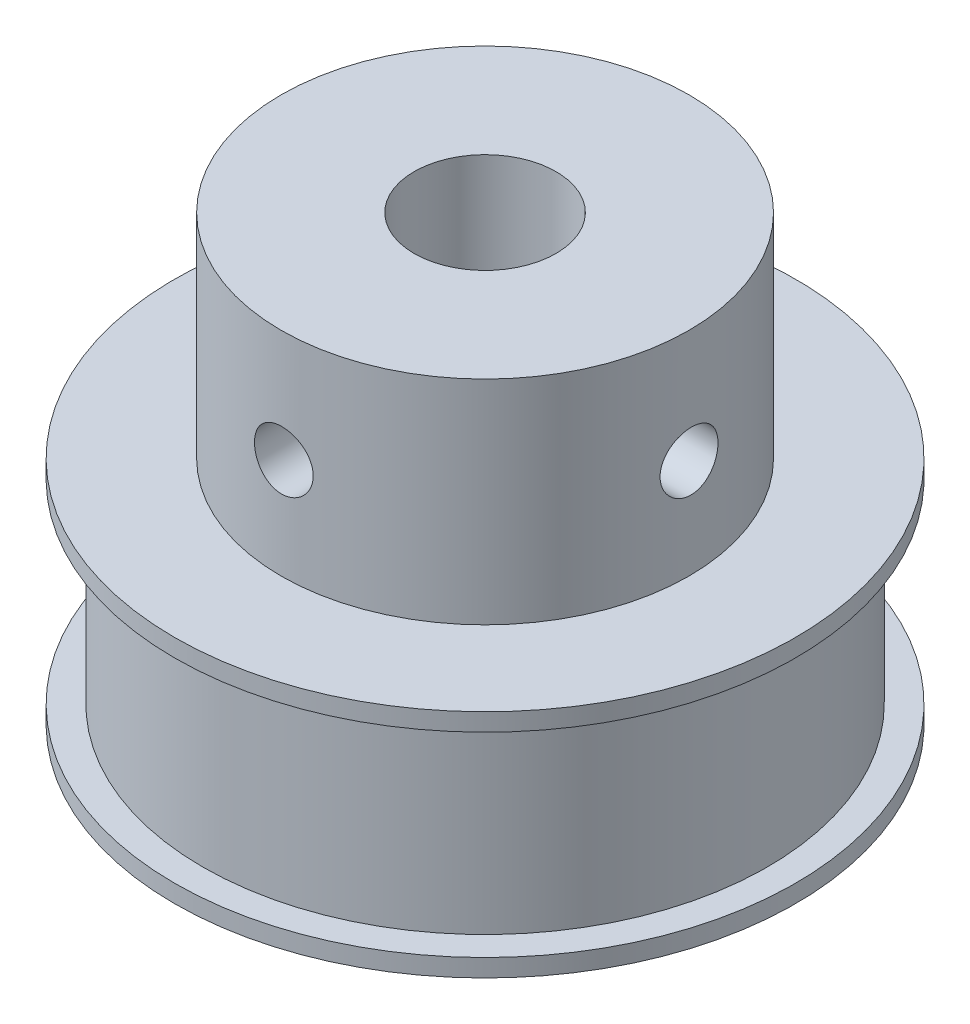
ISO-10303-21;
HEADER;
FILE_DESCRIPTION(('STEP AP214'),'2;1');
FILE_NAME('part.step','',(''),(''),'','','');
FILE_SCHEMA(('AUTOMOTIVE_DESIGN { 1 0 10303 214 1 1 1 1 }'));
ENDSEC;
DATA;
#1=APPLICATION_CONTEXT('core data for automotive mechanical design processes');
#2=APPLICATION_PROTOCOL_DEFINITION('international standard','automotive_design',2000,#1);
#3=PRODUCT_CONTEXT('',#1,'mechanical');
#4=PRODUCT('Part','Part','',(#3));
#5=PRODUCT_RELATED_PRODUCT_CATEGORY('part','',(#4));
#6=PRODUCT_DEFINITION_FORMATION('','',#4);
#7=PRODUCT_DEFINITION_CONTEXT('part definition',#1,'design');
#8=PRODUCT_DEFINITION('design','',#6,#7);
#9=PRODUCT_DEFINITION_SHAPE('','',#8);
#10=(LENGTH_UNIT() NAMED_UNIT(*) SI_UNIT(.MILLI.,.METRE.));
#11=(NAMED_UNIT(*) PLANE_ANGLE_UNIT() SI_UNIT($,.RADIAN.));
#12=(NAMED_UNIT(*) SI_UNIT($,.STERADIAN.) SOLID_ANGLE_UNIT());
#13=UNCERTAINTY_MEASURE_WITH_UNIT(LENGTH_MEASURE(1.E-05),#10,'distance_accuracy_value','');
#14=(GEOMETRIC_REPRESENTATION_CONTEXT(3) GLOBAL_UNCERTAINTY_ASSIGNED_CONTEXT((#13)) GLOBAL_UNIT_ASSIGNED_CONTEXT((#10,
#11,#12)) REPRESENTATION_CONTEXT('',''));
#15=CARTESIAN_POINT('',(0.,0.,0.));
#16=DIRECTION('',(0.,0.,1.));
#17=DIRECTION('',(1.,0.,0.));
#18=AXIS2_PLACEMENT_3D('',#15,#16,#17);
#19=CARTESIAN_POINT('',(0.,1.,0.));
#20=DIRECTION('',(0.,-1.,0.));
#21=DIRECTION('',(0.,0.,-1.));
#22=AXIS2_PLACEMENT_3D('',#19,#20,#21);
#23=CYLINDRICAL_SURFACE('',#22,17.5);
#24=CARTESIAN_POINT('',(0.,1.,0.));
#25=DIRECTION('',(0.,1.,0.));
#26=DIRECTION('',(0.,0.,1.));
#27=AXIS2_PLACEMENT_3D('',#24,#25,#26);
#28=CIRCLE('',#27,17.5);
#29=CARTESIAN_POINT('',(0.,1.,17.5));
#30=VERTEX_POINT('',#29);
#31=EDGE_CURVE('E46',#30,#30,#28,.T.);
#32=ORIENTED_EDGE('',*,*,#31,.F.);
#33=EDGE_LOOP('',(#32));
#34=FACE_BOUND('',#33,.T.);
#35=CARTESIAN_POINT('',(0.,0.,0.));
#36=DIRECTION('',(0.,1.,0.));
#37=DIRECTION('',(0.,0.,1.));
#38=AXIS2_PLACEMENT_3D('',#35,#36,#37);
#39=CIRCLE('',#38,17.5);
#40=CARTESIAN_POINT('',(0.,0.,17.5));
#41=VERTEX_POINT('',#40);
#42=EDGE_CURVE('E37',#41,#41,#39,.T.);
#43=ORIENTED_EDGE('',*,*,#42,.T.);
#44=EDGE_LOOP('',(#43));
#45=FACE_BOUND('',#44,.T.);
#46=ADVANCED_FACE('F34',(#34,#45),#23,.T.);
#47=CARTESIAN_POINT('',(0.,1.,0.));
#48=DIRECTION('',(0.,1.,0.));
#49=DIRECTION('',(0.,0.,1.));
#50=AXIS2_PLACEMENT_3D('',#47,#48,#49);
#51=PLANE('',#50);
#52=CARTESIAN_POINT('',(0.,1.,0.));
#53=DIRECTION('',(0.,1.,0.));
#54=DIRECTION('',(0.,0.,1.));
#55=AXIS2_PLACEMENT_3D('',#52,#53,#54);
#56=CIRCLE('',#55,15.915);
#57=CARTESIAN_POINT('',(0.,1.,15.915));
#58=VERTEX_POINT('',#57);
#59=EDGE_CURVE('E41',#58,#58,#56,.T.);
#60=ORIENTED_EDGE('',*,*,#59,.F.);
#61=EDGE_LOOP('',(#60));
#62=FACE_BOUND('',#61,.T.);
#63=ORIENTED_EDGE('',*,*,#31,.T.);
#64=EDGE_LOOP('',(#63));
#65=FACE_BOUND('',#64,.T.);
#66=ADVANCED_FACE('F70',(#62,#65),#51,.T.);
#67=CARTESIAN_POINT('',(0.,0.,0.));
#68=DIRECTION('',(0.,1.,0.));
#69=DIRECTION('',(0.,0.,1.));
#70=AXIS2_PLACEMENT_3D('',#67,#68,#69);
#71=PLANE('',#70);
#72=CARTESIAN_POINT('',(0.,0.,0.));
#73=DIRECTION('',(0.,1.,0.));
#74=DIRECTION('',(0.,0.,1.));
#75=AXIS2_PLACEMENT_3D('',#72,#73,#74);
#76=CIRCLE('',#75,4.);
#77=CARTESIAN_POINT('',(0.,0.,4.));
#78=VERTEX_POINT('',#77);
#79=EDGE_CURVE('E216',#78,#78,#76,.T.);
#80=ORIENTED_EDGE('',*,*,#79,.T.);
#81=EDGE_LOOP('',(#80));
#82=FACE_BOUND('',#81,.T.);
#83=ORIENTED_EDGE('',*,*,#42,.F.);
#84=EDGE_LOOP('',(#83));
#85=FACE_BOUND('',#84,.T.);
#86=ADVANCED_FACE('F67',(#82,#85),#71,.F.);
#87=CARTESIAN_POINT('',(0.,12.,0.));
#88=DIRECTION('',(0.,-1.,0.));
#89=DIRECTION('',(0.,0.,-1.));
#90=AXIS2_PLACEMENT_3D('',#87,#88,#89);
#91=CYLINDRICAL_SURFACE('',#90,15.915);
#92=CARTESIAN_POINT('',(0.,12.,0.));
#93=DIRECTION('',(0.,1.,0.));
#94=DIRECTION('',(0.,0.,1.));
#95=AXIS2_PLACEMENT_3D('',#92,#93,#94);
#96=CIRCLE('',#95,15.915);
#97=CARTESIAN_POINT('',(0.,12.,15.915));
#98=VERTEX_POINT('',#97);
#99=EDGE_CURVE('E55',#98,#98,#96,.T.);
#100=ORIENTED_EDGE('',*,*,#99,.F.);
#101=EDGE_LOOP('',(#100));
#102=FACE_BOUND('',#101,.T.);
#103=ORIENTED_EDGE('',*,*,#59,.T.);
#104=EDGE_LOOP('',(#103));
#105=FACE_BOUND('',#104,.T.);
#106=ADVANCED_FACE('F69',(#102,#105),#91,.T.);
#107=CARTESIAN_POINT('',(0.,13.,0.));
#108=DIRECTION('',(0.,-1.,0.));
#109=DIRECTION('',(0.,0.,-1.));
#110=AXIS2_PLACEMENT_3D('',#107,#108,#109);
#111=CYLINDRICAL_SURFACE('',#110,17.5);
#112=CARTESIAN_POINT('',(0.,13.,0.));
#113=DIRECTION('',(0.,1.,0.));
#114=DIRECTION('',(0.,0.,1.));
#115=AXIS2_PLACEMENT_3D('',#112,#113,#114);
#116=CIRCLE('',#115,17.5);
#117=CARTESIAN_POINT('',(0.,13.,17.5));
#118=VERTEX_POINT('',#117);
#119=EDGE_CURVE('E52',#118,#118,#116,.T.);
#120=ORIENTED_EDGE('',*,*,#119,.F.);
#121=EDGE_LOOP('',(#120));
#122=FACE_BOUND('',#121,.T.);
#123=CARTESIAN_POINT('',(0.,12.,0.));
#124=DIRECTION('',(0.,1.,0.));
#125=DIRECTION('',(0.,0.,1.));
#126=AXIS2_PLACEMENT_3D('',#123,#124,#125);
#127=CIRCLE('',#126,17.5);
#128=CARTESIAN_POINT('',(0.,12.,17.5));
#129=VERTEX_POINT('',#128);
#130=EDGE_CURVE('E56',#129,#129,#127,.T.);
#131=ORIENTED_EDGE('',*,*,#130,.T.);
#132=EDGE_LOOP('',(#131));
#133=FACE_BOUND('',#132,.T.);
#134=ADVANCED_FACE('F76',(#122,#133),#111,.T.);
#135=CARTESIAN_POINT('',(0.,13.,0.));
#136=DIRECTION('',(0.,1.,0.));
#137=DIRECTION('',(0.,0.,1.));
#138=AXIS2_PLACEMENT_3D('',#135,#136,#137);
#139=PLANE('',#138);
#140=CARTESIAN_POINT('',(0.,13.,0.));
#141=DIRECTION('',(0.,1.,0.));
#142=DIRECTION('',(0.,0.,1.));
#143=AXIS2_PLACEMENT_3D('',#140,#141,#142);
#144=CIRCLE('',#143,11.5);
#145=CARTESIAN_POINT('',(0.,13.,11.5));
#146=VERTEX_POINT('',#145);
#147=EDGE_CURVE('E10',#146,#146,#144,.T.);
#148=ORIENTED_EDGE('',*,*,#147,.F.);
#149=EDGE_LOOP('',(#148));
#150=FACE_BOUND('',#149,.T.);
#151=ORIENTED_EDGE('',*,*,#119,.T.);
#152=EDGE_LOOP('',(#151));
#153=FACE_BOUND('',#152,.T.);
#154=ADVANCED_FACE('F106',(#150,#153),#139,.T.);
#155=CARTESIAN_POINT('',(0.,12.,0.));
#156=DIRECTION('',(0.,1.,0.));
#157=DIRECTION('',(0.,0.,1.));
#158=AXIS2_PLACEMENT_3D('',#155,#156,#157);
#159=PLANE('',#158);
#160=ORIENTED_EDGE('',*,*,#99,.T.);
#161=EDGE_LOOP('',(#160));
#162=FACE_BOUND('',#161,.T.);
#163=ORIENTED_EDGE('',*,*,#130,.F.);
#164=EDGE_LOOP('',(#163));
#165=FACE_BOUND('',#164,.T.);
#166=ADVANCED_FACE('F114',(#162,#165),#159,.F.);
#167=CARTESIAN_POINT('',(0.,25.,0.));
#168=DIRECTION('',(0.,-1.,0.));
#169=DIRECTION('',(0.,0.,-1.));
#170=AXIS2_PLACEMENT_3D('',#167,#168,#169);
#171=CYLINDRICAL_SURFACE('',#170,11.5);
#172=CARTESIAN_POINT('',(11.3633002197072,18.5555826337603,-1.7678823820613));
#173=CARTESIAN_POINT('',(11.363301746953,18.4634146391082,-1.76787855734955));
#174=CARTESIAN_POINT('',(11.3645122077949,18.3711919979247,-1.76014575786559));
#175=CARTESIAN_POINT('',(11.3692270658384,18.1893218524476,-1.72942423066676));
#176=CARTESIAN_POINT('',(11.3727337448417,18.0996770023601,-1.7064203274109));
#177=CARTESIAN_POINT('',(11.3816562009725,17.9256214712274,-1.64585325964429));
#178=CARTESIAN_POINT('',(11.3870705598998,17.8412069565337,-1.60830090862589));
#179=CARTESIAN_POINT('',(11.3992293567231,17.6798994432766,-1.51972340610917));
#180=CARTESIAN_POINT('',(11.4059735992241,17.6030053422465,-1.46870023345635));
#181=CARTESIAN_POINT('',(11.4201320316646,17.458344428998,-1.35422409156919));
#182=CARTESIAN_POINT('',(11.4275503247355,17.3906407747696,-1.2906918088107));
#183=CARTESIAN_POINT('',(11.4422454638316,17.2668294550552,-1.15316591906832));
#184=CARTESIAN_POINT('',(11.4495223022721,17.2107224098225,-1.07917175287892));
#185=CARTESIAN_POINT('',(11.4632176576778,17.1114655867573,-0.922414508616155));
#186=CARTESIAN_POINT('',(11.469632270248,17.0683737160943,-0.839614395172731));
#187=CARTESIAN_POINT('',(11.4809139282996,16.9967418678305,-0.667843461944274));
#188=CARTESIAN_POINT('',(11.4857810487464,16.9682011852831,-0.578872941327924));
#189=CARTESIAN_POINT('',(11.4934672349107,16.9266726403017,-0.39793244444028));
#190=CARTESIAN_POINT('',(11.4963001526577,16.9135791882084,-0.305987298298956));
#191=CARTESIAN_POINT('',(11.4997330186293,16.9029890893521,-0.12116417994805));
#192=CARTESIAN_POINT('',(11.500333080914,16.9054916458871,-0.0282862556302228));
#193=CARTESIAN_POINT('',(11.4993176215945,16.9259388402547,0.155045721335986));
#194=CARTESIAN_POINT('',(11.4977183452585,16.9437698916897,0.245512568653509));
#195=CARTESIAN_POINT('',(11.4925881130679,16.9941898278346,0.422176695521253));
#196=CARTESIAN_POINT('',(11.4890571109827,17.0267790657386,0.508373872834675));
#197=CARTESIAN_POINT('',(11.4805110117086,17.1059078151773,0.674394233718268));
#198=CARTESIAN_POINT('',(11.4754907888106,17.1524955149133,0.754194173654673));
#199=CARTESIAN_POINT('',(11.4645924847092,17.2582635902214,0.904895760034423));
#200=CARTESIAN_POINT('',(11.4587143517857,17.3174447251029,0.975796869521037));
#201=CARTESIAN_POINT('',(11.4467542277191,17.4473534647785,1.10735211014493));
#202=CARTESIAN_POINT('',(11.440670877982,17.5181801940141,1.16790827561448));
#203=CARTESIAN_POINT('',(11.4290891397253,17.6690318044367,1.27628417575162));
#204=CARTESIAN_POINT('',(11.4235907542519,17.7490567335197,1.32410384409462));
#205=CARTESIAN_POINT('',(11.4138437744729,17.916131116765,1.405655148645));
#206=CARTESIAN_POINT('',(11.4095960199267,18.0031852410576,1.43937732517867));
#207=CARTESIAN_POINT('',(11.4028769113898,18.1817942631734,1.49167688337972));
#208=CARTESIAN_POINT('',(11.4004054433481,18.2733488716283,1.51025523740421));
#209=CARTESIAN_POINT('',(11.3975570010084,18.4574900484925,1.53160412194091));
#210=CARTESIAN_POINT('',(11.3971616364437,18.5500602516931,1.53451345563477));
#211=CARTESIAN_POINT('',(11.3984639456774,18.734366145328,1.52480907383263));
#212=CARTESIAN_POINT('',(11.4001615602335,18.8261018593086,1.51219579770737));
#213=CARTESIAN_POINT('',(11.4054305831782,19.0057092467464,1.47192334306857));
#214=CARTESIAN_POINT('',(11.4089934448721,19.0935965796362,1.44433277048952));
#215=CARTESIAN_POINT('',(11.4175605880561,19.2635051454191,1.37496341684017));
#216=CARTESIAN_POINT('',(11.4225649351202,19.3455261112366,1.33318399029692));
#217=CARTESIAN_POINT('',(11.4334581899681,19.5019966025271,1.23629200590573));
#218=CARTESIAN_POINT('',(11.4393529697073,19.5763899080668,1.1810893330842));
#219=CARTESIAN_POINT('',(11.4512952975939,19.7149165922995,1.05904948106147));
#220=CARTESIAN_POINT('',(11.4573428536095,19.7790494413099,0.992211701584885));
#221=CARTESIAN_POINT('',(11.4689063554403,19.8957294673449,0.848195141947714));
#222=CARTESIAN_POINT('',(11.4744179173477,19.9481850024976,0.770941715041258));
#223=CARTESIAN_POINT('',(11.4841692187356,20.0393841256098,0.608651238727595));
#224=CARTESIAN_POINT('',(11.488408990559,20.0781280622743,0.523614387332918));
#225=CARTESIAN_POINT('',(11.495051901654,20.1406563927066,0.348466773872339));
#226=CARTESIAN_POINT('',(11.4974612956441,20.1644916821222,0.258374431261505));
#227=CARTESIAN_POINT('',(11.5001161900675,20.1966910928171,0.0754365778802376));
#228=CARTESIAN_POINT('',(11.5003618207511,20.205056145321,-0.017408766832485));
#229=CARTESIAN_POINT('',(11.4985885350855,20.2060563817437,-0.20232561214473));
#230=CARTESIAN_POINT('',(11.4965899252199,20.1988320809308,-0.294396578470537));
#231=CARTESIAN_POINT('',(11.4905047644625,20.1691588740613,-0.475978478185961));
#232=CARTESIAN_POINT('',(11.4864182186441,20.1467100049969,-0.565489417795297));
#233=CARTESIAN_POINT('',(11.4765370706251,20.087273207893,-0.739380069004518));
#234=CARTESIAN_POINT('',(11.4707435155724,20.0502941886039,-0.823762888230684));
#235=CARTESIAN_POINT('',(11.4580132811528,19.9628616053497,-0.985135052618604));
#236=CARTESIAN_POINT('',(11.4510765710811,19.9124076794294,-1.06212419910028));
#237=CARTESIAN_POINT('',(11.4366925580223,19.7989459583509,-1.20724241550602));
#238=CARTESIAN_POINT('',(11.4292413843233,19.7358341508923,-1.2752897858191));
#239=CARTESIAN_POINT('',(11.4146518507731,19.5990667513725,-1.39988158608475));
#240=CARTESIAN_POINT('',(11.407513564887,19.5254086835982,-1.45642330754252));
#241=CARTESIAN_POINT('',(11.3942697245514,19.3691990138123,-1.55666131978802));
#242=CARTESIAN_POINT('',(11.388169638323,19.2866038555789,-1.60029043854875));
#243=CARTESIAN_POINT('',(11.3777151011253,19.1152079398115,-1.67300943680748));
#244=CARTESIAN_POINT('',(11.373358815216,19.0264138214259,-1.70211460734605));
#245=CARTESIAN_POINT('',(11.3678791529116,18.8735997875475,-1.73825620014595));
#246=CARTESIAN_POINT('',(11.3661705734369,18.8105297052981,-1.74934937063608));
#247=CARTESIAN_POINT('',(11.3638805831592,18.6835093964997,-1.7641637473038));
#248=CARTESIAN_POINT('',(11.3632991596005,18.6195591799192,-1.76788503690747));
#249=CARTESIAN_POINT('',(11.3633002197072,18.5555826337603,-1.7678823820613));
#250=B_SPLINE_CURVE_WITH_KNOTS('',3,(#172,#173,#174,#175,#176,#177,#178,#179,#180,#181,#182,
#183,#184,#185,#186,#187,#188,#189,#190,#191,#192,#193,#194,#195,#196,#197,#198,#199,#200,#201,
#202,#203,#204,#205,#206,#207,#208,#209,#210,#211,#212,#213,#214,#215,#216,#217,#218,#219,#220,
#221,#222,#223,#224,#225,#226,#227,#228,#229,#230,#231,#232,#233,#234,#235,#236,#237,#238,#239,
#240,#241,#242,#243,#244,#245,#246,#247,#248,#249),.UNSPECIFIED.,.T.,.F.,(4,2,2,2,2,2,2,2,2,2,2,
2,2,2,2,2,2,2,2,2,2,2,2,2,2,2,2,2,2,2,2,2,2,2,2,2,2,2,4),(0.,0.276270178732203,
0.552815310609111,0.829155286638696,1.10545469126394,1.38356590975042,1.66169199937949,
1.94103789345256,2.22037025305451,2.49778196289457,2.77517950163214,3.05053903036026,
3.32590514935922,3.60223026316008,3.87857204245098,4.15740089470301,4.43623119891183,
4.71524830417321,4.99424749284584,5.27077106692327,5.54728681412259,5.82254649480197,
6.09781869914867,6.37499255803534,6.65218072104379,6.93147300815784,7.21075819197056,
7.48908466286139,7.76739437945643,8.04320602504448,8.31901700047681,8.59465913342692,
8.87030867126039,9.14832362029231,9.42640394009688,9.70590639909855,9.98511396939671,
10.1768834869431,10.3686508342603),.UNSPECIFIED.);
#251=CARTESIAN_POINT('',(11.3633002197072,18.5555826337603,-1.7678823820613));
#252=VERTEX_POINT('',#251);
#253=EDGE_CURVE('E198',#252,#252,#250,.T.);
#254=ORIENTED_EDGE('',*,*,#253,.T.);
#255=EDGE_LOOP('',(#254));
#256=FACE_BOUND('',#255,.T.);
#257=CARTESIAN_POINT('',(1.68645530331705,18.671535984133,11.3756700246585));
#258=CARTESIAN_POINT('',(1.68645146776555,18.5793679894809,11.3756715244733));
#259=CARTESIAN_POINT('',(1.67871019751295,18.4871453482974,11.3768265734702));
#260=CARTESIAN_POINT('',(1.64795569130648,18.3052752028203,11.3813212890112));
#261=CARTESIAN_POINT('',(1.62492726385899,18.2156303527327,11.3846631286143));
#262=CARTESIAN_POINT('',(1.56429784850835,18.0415748216,11.3931515863948));
#263=CARTESIAN_POINT('',(1.52670768397711,17.9571603069063,11.3982968638525));
#264=CARTESIAN_POINT('',(1.43804537419274,17.7958527936493,11.4098209740564));
#265=CARTESIAN_POINT('',(1.38697520913375,17.7189586926192,11.4161996255847));
#266=CARTESIAN_POINT('',(1.27240060317664,17.5742977793707,11.4295378391199));
#267=CARTESIAN_POINT('',(1.20881682140259,17.5065941251423,11.436500936125));
#268=CARTESIAN_POINT('',(1.07118921493695,17.3827828054278,11.4502107647536));
#269=CARTESIAN_POINT('',(0.997144831108499,17.3266757601952,11.4569574847877));
#270=CARTESIAN_POINT('',(0.840293523586584,17.22741893713,11.4695298241567));
#271=CARTESIAN_POINT('',(0.757449593435392,17.184327066467,11.4753512739567));
#272=CARTESIAN_POINT('',(0.585602268419273,17.1126952182031,11.4854024527618));
#273=CARTESIAN_POINT('',(0.496599172178468,17.0841545356557,11.489632258873));
#274=CARTESIAN_POINT('',(0.315608268734573,17.0426259906743,11.4960223873743));
#275=CARTESIAN_POINT('',(0.223645191819126,17.029532538581,11.4981967392672));
#276=CARTESIAN_POINT('',(0.0388022279354141,17.0189424397247,11.5003058500791));
#277=CARTESIAN_POINT('',(-0.0540776119591993,17.0214449962598,11.5002407233982));
#278=CARTESIAN_POINT('',(-0.237397614662105,17.0418921906274,11.4979123022648));
#279=CARTESIAN_POINT('',(-0.327850688156847,17.0597232420623,11.4956651610307));
#280=CARTESIAN_POINT('',(-0.504473542564695,17.1101431782073,11.4892698263955));
#281=CARTESIAN_POINT('',(-0.590643220912528,17.1427324161112,11.4851215874972));
#282=CARTESIAN_POINT('',(-0.7565981185331,17.2218611655499,11.4753867019577));
#283=CARTESIAN_POINT('',(-0.83636005805885,17.268448865286,11.4697950962053));
#284=CARTESIAN_POINT('',(-0.986979728009564,17.3742169405941,11.4578177762381));
#285=CARTESIAN_POINT('',(-1.05783692112116,17.4333980754756,11.45143201415));
#286=CARTESIAN_POINT('',(-1.18930313179677,17.5633068151512,11.4385300238425));
#287=CARTESIAN_POINT('',(-1.2498141764755,17.6341335443868,11.4320131386749));
#288=CARTESIAN_POINT('',(-1.35810435104833,17.7849851548093,11.4196555303881));
#289=CARTESIAN_POINT('',(-1.40588341464135,17.8650100838923,11.4138148107901));
#290=CARTESIAN_POINT('',(-1.48736282175475,18.0320844671377,11.4034840264476));
#291=CARTESIAN_POINT('',(-1.52105371185822,18.1191385914303,11.3989948691895));
#292=CARTESIAN_POINT('',(-1.57330380783734,18.297747613546,11.3919013737374));
#293=CARTESIAN_POINT('',(-1.59186398522835,18.389302222001,11.3892969145317));
#294=CARTESIAN_POINT('',(-1.61319192226202,18.5734433988652,11.3862956486968));
#295=CARTESIAN_POINT('',(-1.61609834981907,18.6660136020658,11.3858794581912));
#296=CARTESIAN_POINT('',(-1.60640354378071,18.8503194957006,11.3872512349152));
#297=CARTESIAN_POINT('',(-1.59380274912051,18.9420552096813,11.3890391397574));
#298=CARTESIAN_POINT('',(-1.55356906302575,19.1216625971191,11.3945964510367));
#299=CARTESIAN_POINT('',(-1.52600471455645,19.2095499300088,11.3983568196559));
#300=CARTESIAN_POINT('',(-1.45669849616558,19.3794584957918,11.4074205529055));
#301=CARTESIAN_POINT('',(-1.41495598125722,19.4614794616093,11.4127239877308));
#302=CARTESIAN_POINT('',(-1.31814449712935,19.6179499528998,11.4243108847012));
#303=CARTESIAN_POINT('',(-1.26298545730113,19.6923432584395,11.430600864037));
#304=CARTESIAN_POINT('',(-1.14103426374175,19.8308699426721,11.4434169112639));
#305=CARTESIAN_POINT('',(-1.07424150980694,19.8950027916826,11.4499429913222));
#306=CARTESIAN_POINT('',(-0.930311459170629,20.0116828177176,11.4625376151016));
#307=CARTESIAN_POINT('',(-0.853099486240957,20.0641383528703,11.4686023096329));
#308=CARTESIAN_POINT('',(-0.690883008955935,20.1553374759824,11.4795156536717));
#309=CARTESIAN_POINT('',(-0.60587870283967,20.1940814126469,11.4843643341033));
#310=CARTESIAN_POINT('',(-0.430783156457638,20.2566097430792,11.4922614478754));
#311=CARTESIAN_POINT('',(-0.340710379969626,20.2804450324949,11.4953160038576));
#312=CARTESIAN_POINT('',(-0.157796232058358,20.3126444431898,11.4992809954138));
#313=CARTESIAN_POINT('',(-0.0649550276213806,20.3210094956937,11.5001915600454));
#314=CARTESIAN_POINT('',(0.119969775229525,20.3220097321164,11.499742658232));
#315=CARTESIAN_POINT('',(0.212052693952367,20.3147854313035,11.4984034939234));
#316=CARTESIAN_POINT('',(0.393673517542938,20.285112224434,11.4936189433711));
#317=CARTESIAN_POINT('',(0.483211428593891,20.2626633553695,11.490173562245));
#318=CARTESIAN_POINT('',(0.657168387048716,20.2032265582657,11.4815380385616));
#319=CARTESIAN_POINT('',(0.741590534499702,20.1662475389766,11.4763489653815));
#320=CARTESIAN_POINT('',(0.903049731784043,20.0788149557223,11.4647747734047));
#321=CARTESIAN_POINT('',(0.980086583162324,20.0283610298021,11.4583896224811));
#322=CARTESIAN_POINT('',(1.12530409335412,19.9148993087236,11.4450452866732));
#323=CARTESIAN_POINT('',(1.19340308237321,19.8517875012649,11.4380816460596));
#324=CARTESIAN_POINT('',(1.31809617474416,19.7150201017452,11.4243847888427));
#325=CARTESIAN_POINT('',(1.37468756914096,19.6413620339709,11.417651626805));
#326=CARTESIAN_POINT('',(1.47501786047801,19.4851523641849,11.405126011212));
#327=CARTESIAN_POINT('',(1.51868954795164,19.4025572059516,11.3993385446646));
#328=CARTESIAN_POINT('',(1.59148155461107,19.2311612901842,11.3894050748647));
#329=CARTESIAN_POINT('',(1.62061717758678,19.1423671717986,11.3852573462308));
#330=CARTESIAN_POINT('',(1.65679708776996,18.9895531379202,11.3800366634957));
#331=CARTESIAN_POINT('',(1.66790221027694,18.9264830556708,11.3784075749624));
#332=CARTESIAN_POINT('',(1.68273260747802,18.7994627468724,11.3762237410898));
#333=CARTESIAN_POINT('',(1.68645796568741,18.7355125302919,11.3756689835925));
#334=CARTESIAN_POINT('',(1.68645530331705,18.671535984133,11.3756700246585));
#335=B_SPLINE_CURVE_WITH_KNOTS('',3,(#257,#258,#259,#260,#261,#262,#263,#264,#265,#266,#267,
#268,#269,#270,#271,#272,#273,#274,#275,#276,#277,#278,#279,#280,#281,#282,#283,#284,#285,#286,
#287,#288,#289,#290,#291,#292,#293,#294,#295,#296,#297,#298,#299,#300,#301,#302,#303,#304,#305,
#306,#307,#308,#309,#310,#311,#312,#313,#314,#315,#316,#317,#318,#319,#320,#321,#322,#323,#324,
#325,#326,#327,#328,#329,#330,#331,#332,#333,#334),.UNSPECIFIED.,.T.,.F.,(4,2,2,2,2,2,2,2,2,2,2,
2,2,2,2,2,2,2,2,2,2,2,2,2,2,2,2,2,2,2,2,2,2,2,2,2,2,2,4),(0.,0.276270178732206,
0.552815310609111,0.829155286638696,1.10545469126394,1.38356590975042,1.66169199937949,
1.94103789345256,2.22037025305451,2.49778196289457,2.77517950163214,3.05053903036026,
3.32590514935923,3.60223026316008,3.87857204245098,4.15740089470301,4.43623119891183,
4.71524830417321,4.99424749284584,5.27077106692327,5.54728681412259,5.82254649480197,
6.09781869914867,6.37499255803534,6.65218072104379,6.93147300815784,7.21075819197056,
7.48908466286139,7.76739437945644,8.04320602504448,8.31901700047681,8.59465913342692,
8.87030867126039,9.14832362029232,9.42640394009688,9.70590639909855,9.98511396939671,
10.1768834869431,10.3686508342603),.UNSPECIFIED.);
#336=CARTESIAN_POINT('',(1.68645530331705,18.671535984133,11.3756700246585));
#337=VERTEX_POINT('',#336);
#338=EDGE_CURVE('E210',#337,#337,#335,.T.);
#339=ORIENTED_EDGE('',*,*,#338,.T.);
#340=EDGE_LOOP('',(#339));
#341=FACE_BOUND('',#340,.T.);
#342=CARTESIAN_POINT('',(0.,25.,0.));
#343=DIRECTION('',(0.,1.,0.));
#344=DIRECTION('',(0.,0.,1.));
#345=AXIS2_PLACEMENT_3D('',#342,#343,#344);
#346=CIRCLE('',#345,11.5);
#347=CARTESIAN_POINT('',(0.,25.,11.5));
#348=VERTEX_POINT('',#347);
#349=EDGE_CURVE('E50',#348,#348,#346,.T.);
#350=ORIENTED_EDGE('',*,*,#349,.F.);
#351=EDGE_LOOP('',(#350));
#352=FACE_BOUND('',#351,.T.);
#353=ORIENTED_EDGE('',*,*,#147,.T.);
#354=EDGE_LOOP('',(#353));
#355=FACE_BOUND('',#354,.T.);
#356=ADVANCED_FACE('F119',(#256,#341,#352,#355),#171,.T.);
#357=CARTESIAN_POINT('',(0.,25.,0.));
#358=DIRECTION('',(0.,1.,0.));
#359=DIRECTION('',(0.,0.,1.));
#360=AXIS2_PLACEMENT_3D('',#357,#358,#359);
#361=PLANE('',#360);
#362=CARTESIAN_POINT('',(0.,25.,0.));
#363=DIRECTION('',(0.,1.,0.));
#364=DIRECTION('',(0.,0.,1.));
#365=AXIS2_PLACEMENT_3D('',#362,#363,#364);
#366=CIRCLE('',#365,4.);
#367=CARTESIAN_POINT('',(0.,25.,4.));
#368=VERTEX_POINT('',#367);
#369=EDGE_CURVE('E215',#368,#368,#366,.T.);
#370=ORIENTED_EDGE('',*,*,#369,.F.);
#371=EDGE_LOOP('',(#370));
#372=FACE_BOUND('',#371,.T.);
#373=ORIENTED_EDGE('',*,*,#349,.T.);
#374=EDGE_LOOP('',(#373));
#375=FACE_BOUND('',#374,.T.);
#376=ADVANCED_FACE('F137',(#372,#375),#361,.T.);
#377=CARTESIAN_POINT('',(0.,0.,0.));
#378=DIRECTION('',(0.,1.,0.));
#379=DIRECTION('',(0.,0.,1.));
#380=AXIS2_PLACEMENT_3D('',#377,#378,#379);
#381=CYLINDRICAL_SURFACE('',#380,4.);
#382=CARTESIAN_POINT('',(3.62653140315297,18.5555826337603,-1.68768183670542));
#383=CARTESIAN_POINT('',(3.62654055098481,18.643679113986,-1.68767249915754));
#384=CARTESIAN_POINT('',(3.62984615635902,18.7319230657339,-1.68061570825626));
#385=CARTESIAN_POINT('',(3.64265702682386,18.9058696948392,-1.65265556214374));
#386=CARTESIAN_POINT('',(3.65217927918879,18.9915647343579,-1.6317142644294));
#387=CARTESIAN_POINT('',(3.67616497129111,19.1575855718909,-1.57692573053519));
#388=CARTESIAN_POINT('',(3.69060851724361,19.2379314539789,-1.54313039240457));
#389=CARTESIAN_POINT('',(3.72280983611381,19.3917644005945,-1.46373314471862));
#390=CARTESIAN_POINT('',(3.74056677872475,19.4652531765444,-1.41813419193443));
#391=CARTESIAN_POINT('',(3.77864374855195,19.6078113216068,-1.31343702903357));
#392=CARTESIAN_POINT('',(3.79905119637381,19.6764118895405,-1.25373197633761));
#393=CARTESIAN_POINT('',(3.83950136211503,19.8029374056691,-1.12376982362264));
#394=CARTESIAN_POINT('',(3.85954393841967,19.8608582852325,-1.05350872049813));
#395=CARTESIAN_POINT('',(3.89808829385387,19.9667540050622,-0.900756352920529));
#396=CARTESIAN_POINT('',(3.91648883379214,20.0142035664665,-0.817873079201543));
#397=CARTESIAN_POINT('',(3.94873536200451,20.094252779082,-0.644401985912059));
#398=CARTESIAN_POINT('',(3.96258333326181,20.1268588981069,-0.553817542472878));
#399=CARTESIAN_POINT('',(3.9836177178287,20.1746033404165,-0.372417760674003));
#400=CARTESIAN_POINT('',(3.9911085085599,20.1905494816835,-0.281850994448633));
#401=CARTESIAN_POINT('',(3.99981887134741,20.2071292856155,-0.0990421912676218));
#402=CARTESIAN_POINT('',(4.00104093364186,20.2077690290823,-0.0068008341552129));
#403=CARTESIAN_POINT('',(3.99727818684561,20.1941461376237,0.170872381452384));
#404=CARTESIAN_POINT('',(3.99265939070432,20.1807704500432,0.25638213648955));
#405=CARTESIAN_POINT('',(3.97836666598401,20.1410138163126,0.423870467151473));
#406=CARTESIAN_POINT('',(3.96869236514751,20.1146319124696,0.505848782260648));
#407=CARTESIAN_POINT('',(3.94509868822887,20.0492949720401,0.66543804926114));
#408=CARTESIAN_POINT('',(3.93111692975773,20.0101546438354,0.742963516494353));
#409=CARTESIAN_POINT('',(3.90032856491096,19.9205913545737,0.890579097079692));
#410=CARTESIAN_POINT('',(3.88352096751634,19.870164433257,0.960666587825524));
#411=CARTESIAN_POINT('',(3.84744457054499,19.7553943947317,1.09656315713288));
#412=CARTESIAN_POINT('',(3.82808593108117,19.6903292228616,1.16173947627585));
#413=CARTESIAN_POINT('',(3.79000841427787,19.5501729674387,1.28052147503709));
#414=CARTESIAN_POINT('',(3.77128977621594,19.475078184497,1.33412286609935));
#415=CARTESIAN_POINT('',(3.73608755791471,19.313984230213,1.42980343124216));
#416=CARTESIAN_POINT('',(3.71969352210871,19.2277150620677,1.47146399805705));
#417=CARTESIAN_POINT('',(3.69211856004094,19.0485359623544,1.53935676469979));
#418=CARTESIAN_POINT('',(3.68093399394532,18.9556307198865,1.56559974009215));
#419=CARTESIAN_POINT('',(3.66597592682319,18.7721597385753,1.60029914510317));
#420=CARTESIAN_POINT('',(3.66177422949841,18.6818243325775,1.60978569885469));
#421=CARTESIAN_POINT('',(3.66004360140838,18.5007770040617,1.61371917135437));
#422=CARTESIAN_POINT('',(3.66251243747392,18.410065217701,1.60817112340279));
#423=CARTESIAN_POINT('',(3.67339693751376,18.2367816247108,1.58313520122711));
#424=CARTESIAN_POINT('',(3.68143317047467,18.1540544540857,1.56453581779462));
#425=CARTESIAN_POINT('',(3.70204997038935,17.9929455693803,1.51510323803744));
#426=CARTESIAN_POINT('',(3.71463158550951,17.9145648624087,1.48426721977979));
#427=CARTESIAN_POINT('',(3.74353942904567,17.7607036280647,1.40981073764943));
#428=CARTESIAN_POINT('',(3.76000052936548,17.6854824389811,1.36570851017162));
#429=CARTESIAN_POINT('',(3.79457680700934,17.5431224643306,1.26646953584338));
#430=CARTESIAN_POINT('',(3.81269268809807,17.4759871460252,1.21132808210838));
#431=CARTESIAN_POINT('',(3.85022840061875,17.3461530073136,1.08642386849382));
#432=CARTESIAN_POINT('',(3.86963743089266,17.2842308967116,1.01584734025984));
#433=CARTESIAN_POINT('',(3.90615574071522,17.1729397780983,0.864854802985953));
#434=CARTESIAN_POINT('',(3.92326487153075,17.1235715817571,0.784438158233389));
#435=CARTESIAN_POINT('',(3.95328083057253,17.0388784995535,0.615571767498644));
#436=CARTESIAN_POINT('',(3.96618000709218,17.0035791587576,0.527107764142672));
#437=CARTESIAN_POINT('',(3.98615967200563,16.9485909769016,0.344840430522556));
#438=CARTESIAN_POINT('',(3.99324354685529,16.9288930508214,0.25104024178947));
#439=CARTESIAN_POINT('',(4.00040585090976,16.9067944048398,0.0677242284345945));
#440=CARTESIAN_POINT('',(4.00093233963576,16.9032978050184,-0.0216429115452655));
#441=CARTESIAN_POINT('',(3.99600797918934,16.9107680681306,-0.199593475179309));
#442=CARTESIAN_POINT('',(3.99055814144623,16.9217324837558,-0.288177028889771));
#443=CARTESIAN_POINT('',(3.97448061217488,16.9570272758959,-0.458927900432769));
#444=CARTESIAN_POINT('',(3.96403662778267,16.9808870758749,-0.541211058580739));
#445=CARTESIAN_POINT('',(3.93900496364865,17.0407867486403,-0.700535134082641));
#446=CARTESIAN_POINT('',(3.92441648889763,17.076828958547,-0.777575042141854));
#447=CARTESIAN_POINT('',(3.89164736477696,17.1618871604467,-0.92805024532121));
#448=CARTESIAN_POINT('',(3.87333463184557,17.2114138905333,-1.00116743168531));
#449=CARTESIAN_POINT('',(3.83526351361117,17.3212854805503,-1.13834527889568));
#450=CARTESIAN_POINT('',(3.81550460649336,17.3816342568411,-1.20240264604817));
#451=CARTESIAN_POINT('',(3.77507534645833,17.516170161115,-1.32407974873033));
#452=CARTESIAN_POINT('',(3.75443168113086,17.5910103906453,-1.38098880220855));
#453=CARTESIAN_POINT('',(3.71589655116545,17.7498486094414,-1.4815618330491));
#454=CARTESIAN_POINT('',(3.69800661034568,17.8338516254699,-1.52521848987851));
#455=CARTESIAN_POINT('',(3.66734139998287,18.0083110750302,-1.59754449183838));
#456=CARTESIAN_POINT('',(3.65453346608337,18.0987217418514,-1.62630992642965));
#457=CARTESIAN_POINT('',(3.63572441132334,18.2836297778387,-1.66794870326185));
#458=CARTESIAN_POINT('',(3.62970046348347,18.3781123246372,-1.68087535336786));
#459=CARTESIAN_POINT('',(3.62684865905269,18.500445947403,-1.68699718176421));
#460=CARTESIAN_POINT('',(3.6265285397394,18.5280070660453,-1.68768475950305));
#461=CARTESIAN_POINT('',(3.62653140315297,18.5555826337603,-1.68768183670542));
#462=B_SPLINE_CURVE_WITH_KNOTS('',3,(#382,#383,#384,#385,#386,#387,#388,#389,#390,#391,#392,
#393,#394,#395,#396,#397,#398,#399,#400,#401,#402,#403,#404,#405,#406,#407,#408,#409,#410,#411,
#412,#413,#414,#415,#416,#417,#418,#419,#420,#421,#422,#423,#424,#425,#426,#427,#428,#429,#430,
#431,#432,#433,#434,#435,#436,#437,#438,#439,#440,#441,#442,#443,#444,#445,#446,#447,#448,#449,
#450,#451,#452,#453,#454,#455,#456,#457,#458,#459,#460,#461),.UNSPECIFIED.,.T.,.F.,(4,2,2,2,2,2,
2,2,2,2,2,2,2,2,2,2,2,2,2,2,2,2,2,2,2,2,2,2,2,2,2,2,2,2,2,2,2,2,2,4),(0.,0.264211724660743,
0.529148459018595,0.793026677872046,1.05683885985755,1.33523297260791,1.61373292676209,
1.90403076094907,2.19420198072698,2.46953816244269,2.74476495901023,3.00356896819765,
3.2623920368679,3.52515526924739,3.78801084539544,4.06907613148063,4.35024537535723,
4.64031806272422,4.93018777241108,5.20152035698261,5.4727621157604,5.72713321026163,
5.98156300028878,6.24665916965705,6.51186861189121,6.79815687284344,7.08446363898861,
7.37128791456168,7.65794504349148,7.92489841526076,8.19180661499932,8.44957452423756,
8.70739191275385,8.97680852354691,9.24632283025303,9.53374725602172,9.82133016535512,
10.1070334851925,10.3917725616093,10.4744749384331),.UNSPECIFIED.);
#463=CARTESIAN_POINT('',(3.62653140315297,18.5555826337603,-1.68768183670542));
#464=VERTEX_POINT('',#463);
#465=EDGE_CURVE('E194',#464,#464,#462,.T.);
#466=ORIENTED_EDGE('',*,*,#465,.T.);
#467=EDGE_LOOP('',(#466));
#468=FACE_BOUND('',#467,.T.);
#469=CARTESIAN_POINT('',(0.,17.0215857548382,4.));
#470=CARTESIAN_POINT('',(0.0883455038391779,17.0209088218341,3.99999306282534));
#471=CARTESIAN_POINT('',(0.176887860955857,17.0273497328041,3.99703918102695));
#472=CARTESIAN_POINT('',(0.35157919248014,17.0542650772688,3.9854869098841));
#473=CARTESIAN_POINT('',(0.437721294594684,17.0747762041971,3.97687376434223));
#474=CARTESIAN_POINT('',(0.60479739721993,17.1289476694126,3.95490755317518));
#475=CARTESIAN_POINT('',(0.685747594312959,17.162564540983,3.94157016926611));
#476=CARTESIAN_POINT('',(0.840764304822868,17.2418058334641,3.91143953504126));
#477=CARTESIAN_POINT('',(0.914832949257092,17.2874265202584,3.89464735978684));
#478=CARTESIAN_POINT('',(1.05771315580536,17.3917207261231,3.85835672273401));
#479=CARTESIAN_POINT('',(1.12614457562701,17.4508843972617,3.83877113222935));
#480=CARTESIAN_POINT('',(1.25245003278525,17.5795775759295,3.79944120428428));
#481=CARTESIAN_POINT('',(1.31031855653998,17.6491124627749,3.7796967895232));
#482=CARTESIAN_POINT('',(1.41671861551825,17.8007597298452,3.7411593020515));
#483=CARTESIAN_POINT('',(1.46464186950818,17.8833259386846,3.72246253117508));
#484=CARTESIAN_POINT('',(1.54577539256664,18.0562165638202,3.68951344673376));
#485=CARTESIAN_POINT('',(1.57899264446703,18.1465372736798,3.67525902476809));
#486=CARTESIAN_POINT('',(1.62820292930565,18.3281523352632,3.65371752920991));
#487=CARTESIAN_POINT('',(1.64490435054793,18.4192196132279,3.64614556516498));
#488=CARTESIAN_POINT('',(1.6628304961721,18.6031539172249,3.6380077949427));
#489=CARTESIAN_POINT('',(1.66406389705216,18.6960199050205,3.63743806099827));
#490=CARTESIAN_POINT('',(1.65151740681716,18.873364497889,3.64314727864623));
#491=CARTESIAN_POINT('',(1.6388726748965,18.9579436575175,3.64890844024552));
#492=CARTESIAN_POINT('',(1.60088119776528,19.1236422981043,3.66573405716771));
#493=CARTESIAN_POINT('',(1.57553217197604,19.2047611550572,3.67679946465314));
#494=CARTESIAN_POINT('',(1.51245664574684,19.3630131079996,3.70319546405675));
#495=CARTESIAN_POINT('',(1.47451373698604,19.4400470748988,3.71859986019385));
#496=CARTESIAN_POINT('',(1.38747395156214,19.5869311048674,3.75194406026082));
#497=CARTESIAN_POINT('',(1.33837279058452,19.6567783935406,3.7698848370551));
#498=CARTESIAN_POINT('',(1.22564057194795,19.7933926067726,3.80810016405846));
#499=CARTESIAN_POINT('',(1.16114385842289,19.8594274206437,3.82844502992366));
#500=CARTESIAN_POINT('',(1.02182402758346,19.979991762228,3.86796005343746));
#501=CARTESIAN_POINT('',(0.946998402376985,20.0345184875851,3.88712992415625));
#502=CARTESIAN_POINT('',(0.786724457935446,20.1317391544254,3.92274898601834));
#503=CARTESIAN_POINT('',(0.701058388839742,20.1741054167775,3.93911873980069));
#504=CARTESIAN_POINT('',(0.52296974748323,20.2435619176883,3.96668641492221));
#505=CARTESIAN_POINT('',(0.430550795919661,20.2706602755319,3.97788708454263));
#506=CARTESIAN_POINT('',(0.247628295451449,20.3072377684354,3.99331772090645));
#507=CARTESIAN_POINT('',(0.157351967472405,20.3176911023518,3.99793132434302));
#508=CARTESIAN_POINT('',(-0.0237827236342381,20.3236150570965,4.00095355182723));
#509=CARTESIAN_POINT('',(-0.114640907225367,20.3190900964394,3.9993640057451));
#510=CARTESIAN_POINT('',(-0.289559406947012,20.2958765116667,3.99041953486518));
#511=CARTESIAN_POINT('',(-0.373732249517163,20.2779087926194,3.98335742417291));
#512=CARTESIAN_POINT('',(-0.537789552427144,20.2293480106308,3.96454343117385));
#513=CARTESIAN_POINT('',(-0.617673496754402,20.198753432337,3.9527909859844));
#514=CARTESIAN_POINT('',(-0.773505830347311,20.1248856845728,3.92531954090661));
#515=CARTESIAN_POINT('',(-0.849273088926918,20.0812707986879,3.90949546483828));
#516=CARTESIAN_POINT('',(-0.992682402857444,19.9829639002862,3.8755671536326));
#517=CARTESIAN_POINT('',(-1.06032114274121,19.928267392054,3.85746199421099));
#518=CARTESIAN_POINT('',(-1.19054759922856,19.8048569103926,3.81936100321871));
#519=CARTESIAN_POINT('',(-1.25244701420285,19.7354282861604,3.79932168703564));
#520=CARTESIAN_POINT('',(-1.36391417505814,19.586884041323,3.76074803057321));
#521=CARTESIAN_POINT('',(-1.41347901560888,19.5077661450074,3.7422140455562));
#522=CARTESIAN_POINT('',(-1.49947733260628,19.340340834971,3.70860377021477));
#523=CARTESIAN_POINT('',(-1.53569340054112,19.2519090913872,3.69358606706036));
#524=CARTESIAN_POINT('',(-1.59240884860612,19.0693923913098,3.66949591613268));
#525=CARTESIAN_POINT('',(-1.61292072059601,18.975311992405,3.66041874381676));
#526=CARTESIAN_POINT('',(-1.63633543658177,18.79171490307,3.65000775775696));
#527=CARTESIAN_POINT('',(-1.64043618973622,18.7023803098237,3.64814749593561));
#528=CARTESIAN_POINT('',(-1.63414301445518,18.5243382271057,3.65097101489766));
#529=CARTESIAN_POINT('',(-1.62375154355381,18.4356306338733,3.65565368615656));
#530=CARTESIAN_POINT('',(-1.58979334956443,18.2656921271474,3.67054117873955));
#531=CARTESIAN_POINT('',(-1.56687256359806,18.1843059990413,3.68047453696872));
#532=CARTESIAN_POINT('',(-1.50916250777776,18.0265190403702,3.70451078725567));
#533=CARTESIAN_POINT('',(-1.47436997279516,17.950119588202,3.7186148262479));
#534=CARTESIAN_POINT('',(-1.39161323159599,17.7996823480297,3.75039753488711));
#535=CARTESIAN_POINT('',(-1.34300794225734,17.7260314278714,3.76823484693437));
#536=CARTESIAN_POINT('',(-1.2348825689579,17.5875430125297,3.80503924754805));
#537=CARTESIAN_POINT('',(-1.17535881482757,17.5227084937206,3.82400671455673));
#538=CARTESIAN_POINT('',(-1.04199305035554,17.3988719846609,3.86256424037498));
#539=CARTESIAN_POINT('',(-0.967427678688353,17.3406287326525,3.8821004236114));
#540=CARTESIAN_POINT('',(-0.808880168648009,17.2374199897135,3.9182028028035));
#541=CARTESIAN_POINT('',(-0.724893534499637,17.1924608754072,3.93476757093256));
#542=CARTESIAN_POINT('',(-0.551015660425333,17.1179777320929,3.96283062780224));
#543=CARTESIAN_POINT('',(-0.461228182321333,17.0882385227462,3.97439916524504));
#544=CARTESIAN_POINT('',(-0.27751199155268,17.0445515670447,3.99141926879494));
#545=CARTESIAN_POINT('',(-0.183597293801987,17.0305541105026,3.99689009012019));
#546=CARTESIAN_POINT('',(-0.0595500261099577,17.0228513328296,3.99966968667776));
#547=CARTESIAN_POINT('',(-0.0297862016099501,17.0218139867465,4.00000233890887));
#548=CARTESIAN_POINT('',(0.,17.0215857548382,4.));
#549=B_SPLINE_CURVE_WITH_KNOTS('',3,(#469,#470,#471,#472,#473,#474,#475,#476,#477,#478,#479,
#480,#481,#482,#483,#484,#485,#486,#487,#488,#489,#490,#491,#492,#493,#494,#495,#496,#497,#498,
#499,#500,#501,#502,#503,#504,#505,#506,#507,#508,#509,#510,#511,#512,#513,#514,#515,#516,#517,
#518,#519,#520,#521,#522,#523,#524,#525,#526,#527,#528,#529,#530,#531,#532,#533,#534,#535,#536,
#537,#538,#539,#540,#541,#542,#543,#544,#545,#546,#547,#548),.UNSPECIFIED.,.T.,.F.,(4,2,2,2,2,2,
2,2,2,2,2,2,2,2,2,2,2,2,2,2,2,2,2,2,2,2,2,2,2,2,2,2,2,2,2,2,2,2,2,4),(0.,0.264960427363375,
0.530614479813131,0.795394854455208,1.0600929590717,1.33655957595389,1.61317009175447,
1.90355183517867,2.19379554874718,2.47096680675145,2.74798258373813,3.00392137353297,
3.25990612398725,3.52053940389544,3.78127292596106,4.06356302854247,4.34592179300049,
4.63529645382427,4.92451708314892,5.19609001523726,5.46758284194447,5.72547484697503,
5.98339781069509,6.24879503672065,6.51430014840709,6.79845089756076,7.08266851339475,
7.37132954929947,7.65976073132273,7.92670611727795,8.19360624119265,8.44789143469107,
8.7022466215834,8.97119243661096,9.24022882221457,9.52868357363412,9.81727656440024,
10.1016681204875,10.3851590649328,10.4744920175465),.UNSPECIFIED.);
#550=CARTESIAN_POINT('',(0.,17.0215857548382,4.));
#551=VERTEX_POINT('',#550);
#552=EDGE_CURVE('E203',#551,#551,#549,.T.);
#553=ORIENTED_EDGE('',*,*,#552,.T.);
#554=EDGE_LOOP('',(#553));
#555=FACE_BOUND('',#554,.T.);
#556=ORIENTED_EDGE('',*,*,#79,.F.);
#557=EDGE_LOOP('',(#556));
#558=FACE_BOUND('',#557,.T.);
#559=ORIENTED_EDGE('',*,*,#369,.T.);
#560=EDGE_LOOP('',(#559));
#561=FACE_BOUND('',#560,.T.);
#562=ADVANCED_FACE('F142',(#468,#555,#558,#561),#381,.F.);
#563=CARTESIAN_POINT('',(0.0368449898380252,18.671535984133,11.499940975793));
#564=DIRECTION('',(0.00320391215982844,0.,0.999994867460265));
#565=DIRECTION('',(0.999994867460265,0.,-0.00320391215982844));
#566=AXIS2_PLACEMENT_3D('',#563,#564,#565);
#567=CYLINDRICAL_SURFACE('',#566,1.64999999999999);
#568=ORIENTED_EDGE('',*,*,#552,.F.);
#569=EDGE_LOOP('',(#568));
#570=FACE_BOUND('',#569,.T.);
#571=ORIENTED_EDGE('',*,*,#338,.F.);
#572=EDGE_LOOP('',(#571));
#573=FACE_BOUND('',#572,.T.);
#574=ADVANCED_FACE('F159',(#570,#573),#567,.F.);
#575=CARTESIAN_POINT('',(11.4993821710583,18.5555826337603,-0.119204378887634));
#576=DIRECTION('',(0.999946275744202,0.,-0.0103655981641422));
#577=DIRECTION('',(-0.0103655981641422,0.,-0.999946275744202));
#578=AXIS2_PLACEMENT_3D('',#575,#576,#577);
#579=CYLINDRICAL_SURFACE('',#578,1.64999999999999);
#580=ORIENTED_EDGE('',*,*,#465,.F.);
#581=EDGE_LOOP('',(#580));
#582=FACE_BOUND('',#581,.T.);
#583=ORIENTED_EDGE('',*,*,#253,.F.);
#584=EDGE_LOOP('',(#583));
#585=FACE_BOUND('',#584,.T.);
#586=ADVANCED_FACE('F170',(#582,#585),#579,.F.);
#587=CLOSED_SHELL('',(#46,#66,#86,#106,#134,#154,#166,#356,#376,#562,#574,#586));
#588=MANIFOLD_SOLID_BREP('B2',#587);
#589=ADVANCED_BREP_SHAPE_REPRESENTATION('',(#18,#588),#14);
#590=SHAPE_DEFINITION_REPRESENTATION(#9,#589);
ENDSEC;
END-ISO-10303-21;
